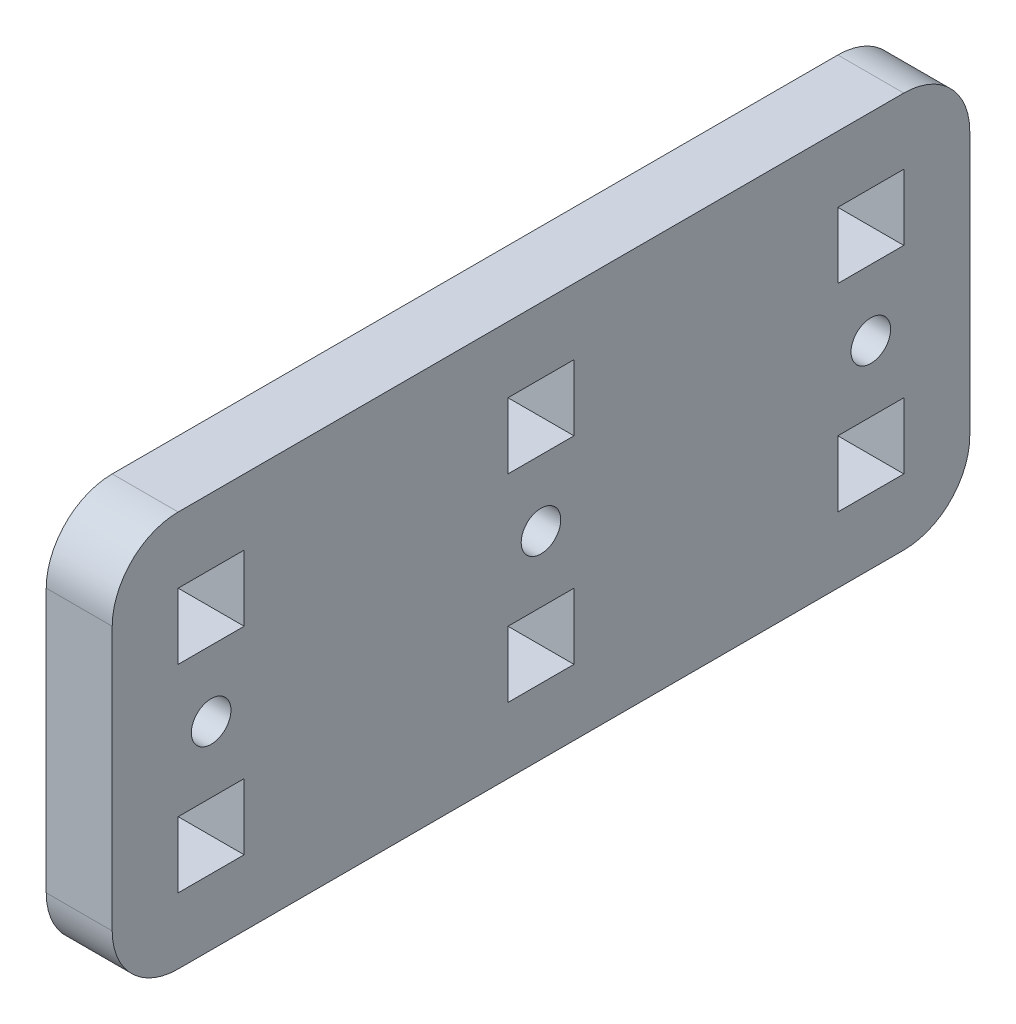
ISO-10303-21;
HEADER;
FILE_DESCRIPTION(('STEP AP214'),'2;1');
FILE_NAME('part.step','',(''),(''),'','','');
FILE_SCHEMA(('AUTOMOTIVE_DESIGN { 1 0 10303 214 1 1 1 1 }'));
ENDSEC;
DATA;
#1=APPLICATION_CONTEXT('core data for automotive mechanical design processes');
#2=APPLICATION_PROTOCOL_DEFINITION('international standard','automotive_design',2000,#1);
#3=PRODUCT_CONTEXT('',#1,'mechanical');
#4=PRODUCT('Part','Part','',(#3));
#5=PRODUCT_RELATED_PRODUCT_CATEGORY('part','',(#4));
#6=PRODUCT_DEFINITION_FORMATION('','',#4);
#7=PRODUCT_DEFINITION_CONTEXT('part definition',#1,'design');
#8=PRODUCT_DEFINITION('design','',#6,#7);
#9=PRODUCT_DEFINITION_SHAPE('','',#8);
#10=(LENGTH_UNIT() NAMED_UNIT(*) SI_UNIT(.MILLI.,.METRE.));
#11=(NAMED_UNIT(*) PLANE_ANGLE_UNIT() SI_UNIT($,.RADIAN.));
#12=(NAMED_UNIT(*) SI_UNIT($,.STERADIAN.) SOLID_ANGLE_UNIT());
#13=UNCERTAINTY_MEASURE_WITH_UNIT(LENGTH_MEASURE(1.E-05),#10,'distance_accuracy_value','');
#14=(GEOMETRIC_REPRESENTATION_CONTEXT(3) GLOBAL_UNCERTAINTY_ASSIGNED_CONTEXT((#13)) GLOBAL_UNIT_ASSIGNED_CONTEXT((#10,
#11,#12)) REPRESENTATION_CONTEXT('',''));
#15=CARTESIAN_POINT('',(0.,0.,0.));
#16=DIRECTION('',(0.,0.,1.));
#17=DIRECTION('',(1.,0.,0.));
#18=AXIS2_PLACEMENT_3D('',#15,#16,#17);
#19=CARTESIAN_POINT('',(5.,0.,0.));
#20=DIRECTION('',(-1.,0.,0.));
#21=DIRECTION('',(0.,0.,1.));
#22=AXIS2_PLACEMENT_3D('',#19,#20,#21);
#23=PLANE('',#22);
#24=DIRECTION('',(0.,0.,-1.));
#25=VECTOR('',#24,1.);
#26=CARTESIAN_POINT('',(4.99999999999997,20.,-30.));
#27=LINE('',#26,#25);
#28=CARTESIAN_POINT('',(4.99999999999997,20.,-30.));
#29=VERTEX_POINT('',#28);
#30=CARTESIAN_POINT('',(5.,20.,-35.));
#31=VERTEX_POINT('',#30);
#32=EDGE_CURVE('E288',#29,#31,#27,.T.);
#33=ORIENTED_EDGE('',*,*,#32,.F.);
#34=DIRECTION('',(0.,-1.,0.));
#35=VECTOR('',#34,1.);
#36=CARTESIAN_POINT('',(4.99999999999997,20.,-30.));
#37=LINE('',#36,#35);
#38=CARTESIAN_POINT('',(5.,25.,-30.));
#39=VERTEX_POINT('',#38);
#40=EDGE_CURVE('E296',#39,#29,#37,.T.);
#41=ORIENTED_EDGE('',*,*,#40,.F.);
#42=DIRECTION('',(0.,0.,1.));
#43=VECTOR('',#42,1.);
#44=CARTESIAN_POINT('',(4.99999999999997,25.,-30.));
#45=LINE('',#44,#43);
#46=CARTESIAN_POINT('',(5.,25.,-35.));
#47=VERTEX_POINT('',#46);
#48=EDGE_CURVE('E293',#47,#39,#45,.T.);
#49=ORIENTED_EDGE('',*,*,#48,.F.);
#50=DIRECTION('',(0.,1.,0.));
#51=VECTOR('',#50,1.);
#52=CARTESIAN_POINT('',(5.,20.,-35.));
#53=LINE('',#52,#51);
#54=EDGE_CURVE('E290',#31,#47,#53,.T.);
#55=ORIENTED_EDGE('',*,*,#54,.F.);
#56=EDGE_LOOP('',(#33,#41,#49,#55));
#57=FACE_BOUND('',#56,.T.);
#58=DIRECTION('',(0.,0.,-1.));
#59=VECTOR('',#58,1.);
#60=CARTESIAN_POINT('',(5.00000000000002,20.,-55.));
#61=LINE('',#60,#59);
#62=CARTESIAN_POINT('',(5.00000000000002,20.,-55.));
#63=VERTEX_POINT('',#62);
#64=CARTESIAN_POINT('',(5.00000000000005,20.,-60.));
#65=VERTEX_POINT('',#64);
#66=EDGE_CURVE('E356',#63,#65,#61,.T.);
#67=ORIENTED_EDGE('',*,*,#66,.F.);
#68=DIRECTION('',(0.,-1.,0.));
#69=VECTOR('',#68,1.);
#70=CARTESIAN_POINT('',(5.00000000000002,20.,-55.));
#71=LINE('',#70,#69);
#72=CARTESIAN_POINT('',(5.,25.,-55.));
#73=VERTEX_POINT('',#72);
#74=EDGE_CURVE('E364',#73,#63,#71,.T.);
#75=ORIENTED_EDGE('',*,*,#74,.F.);
#76=DIRECTION('',(0.,0.,1.));
#77=VECTOR('',#76,1.);
#78=CARTESIAN_POINT('',(5.00000000000002,25.,-55.));
#79=LINE('',#78,#77);
#80=CARTESIAN_POINT('',(5.00000000000005,25.,-60.));
#81=VERTEX_POINT('',#80);
#82=EDGE_CURVE('E361',#81,#73,#79,.T.);
#83=ORIENTED_EDGE('',*,*,#82,.F.);
#84=DIRECTION('',(0.,1.,0.));
#85=VECTOR('',#84,1.);
#86=CARTESIAN_POINT('',(5.00000000000005,20.,-60.));
#87=LINE('',#86,#85);
#88=EDGE_CURVE('E358',#65,#81,#87,.T.);
#89=ORIENTED_EDGE('',*,*,#88,.F.);
#90=EDGE_LOOP('',(#67,#75,#83,#89));
#91=FACE_BOUND('',#90,.T.);
#92=DIRECTION('',(0.,0.,-1.));
#93=VECTOR('',#92,1.);
#94=CARTESIAN_POINT('',(5.,20.,-10.));
#95=LINE('',#94,#93);
#96=CARTESIAN_POINT('',(5.,20.,-5.));
#97=VERTEX_POINT('',#96);
#98=CARTESIAN_POINT('',(5.,20.,-10.));
#99=VERTEX_POINT('',#98);
#100=EDGE_CURVE('E424',#97,#99,#95,.T.);
#101=ORIENTED_EDGE('',*,*,#100,.F.);
#102=DIRECTION('',(0.,-1.,0.));
#103=VECTOR('',#102,1.);
#104=CARTESIAN_POINT('',(5.,20.,-5.));
#105=LINE('',#104,#103);
#106=CARTESIAN_POINT('',(5.,25.,-5.));
#107=VERTEX_POINT('',#106);
#108=EDGE_CURVE('E432',#107,#97,#105,.T.);
#109=ORIENTED_EDGE('',*,*,#108,.F.);
#110=DIRECTION('',(0.,0.,1.));
#111=VECTOR('',#110,1.);
#112=CARTESIAN_POINT('',(5.,25.,-10.));
#113=LINE('',#112,#111);
#114=CARTESIAN_POINT('',(5.,25.,-10.));
#115=VERTEX_POINT('',#114);
#116=EDGE_CURVE('E429',#115,#107,#113,.T.);
#117=ORIENTED_EDGE('',*,*,#116,.F.);
#118=DIRECTION('',(0.,1.,0.));
#119=VECTOR('',#118,1.);
#120=CARTESIAN_POINT('',(5.,20.,-10.));
#121=LINE('',#120,#119);
#122=EDGE_CURVE('E426',#99,#115,#121,.T.);
#123=ORIENTED_EDGE('',*,*,#122,.F.);
#124=EDGE_LOOP('',(#101,#109,#117,#123));
#125=FACE_BOUND('',#124,.T.);
#126=DIRECTION('',(0.,0.,-1.));
#127=VECTOR('',#126,1.);
#128=CARTESIAN_POINT('',(5.,0.,0.));
#129=LINE('',#128,#127);
#130=CARTESIAN_POINT('',(5.,0.,-5.));
#131=VERTEX_POINT('',#130);
#132=CARTESIAN_POINT('',(5.,0.,-60.));
#133=VERTEX_POINT('',#132);
#134=EDGE_CURVE('E458',#131,#133,#129,.T.);
#135=ORIENTED_EDGE('',*,*,#134,.T.);
#136=CARTESIAN_POINT('',(5.,5.00000000000001,-60.));
#137=DIRECTION('',(-1.,0.,0.));
#138=DIRECTION('',(0.,0.,1.));
#139=AXIS2_PLACEMENT_3D('',#136,#137,#138);
#140=CIRCLE('',#139,5.);
#141=CARTESIAN_POINT('',(5.,5.00000000000001,-65.));
#142=VERTEX_POINT('',#141);
#143=EDGE_CURVE('E498',#133,#142,#140,.F.);
#144=ORIENTED_EDGE('',*,*,#143,.T.);
#145=DIRECTION('',(0.,1.,0.));
#146=VECTOR('',#145,1.);
#147=CARTESIAN_POINT('',(5.,0.,-65.));
#148=LINE('',#147,#146);
#149=CARTESIAN_POINT('',(5.,25.,-65.));
#150=VERTEX_POINT('',#149);
#151=EDGE_CURVE('E462',#142,#150,#148,.T.);
#152=ORIENTED_EDGE('',*,*,#151,.T.);
#153=CARTESIAN_POINT('',(5.,25.,-60.));
#154=DIRECTION('',(-1.,0.,0.));
#155=DIRECTION('',(0.,0.,1.));
#156=AXIS2_PLACEMENT_3D('',#153,#154,#155);
#157=CIRCLE('',#156,5.);
#158=CARTESIAN_POINT('',(5.,30.,-60.));
#159=VERTEX_POINT('',#158);
#160=EDGE_CURVE('E55',#150,#159,#157,.F.);
#161=ORIENTED_EDGE('',*,*,#160,.T.);
#162=DIRECTION('',(0.,0.,1.));
#163=VECTOR('',#162,1.);
#164=CARTESIAN_POINT('',(5.,30.,0.));
#165=LINE('',#164,#163);
#166=CARTESIAN_POINT('',(5.,30.,-5.));
#167=VERTEX_POINT('',#166);
#168=EDGE_CURVE('E464',#159,#167,#165,.T.);
#169=ORIENTED_EDGE('',*,*,#168,.T.);
#170=CARTESIAN_POINT('',(5.,25.,-5.));
#171=DIRECTION('',(-1.,0.,0.));
#172=DIRECTION('',(0.,0.,1.));
#173=AXIS2_PLACEMENT_3D('',#170,#171,#172);
#174=CIRCLE('',#173,5.);
#175=CARTESIAN_POINT('',(5.,25.,0.));
#176=VERTEX_POINT('',#175);
#177=EDGE_CURVE('E493',#167,#176,#174,.F.);
#178=ORIENTED_EDGE('',*,*,#177,.T.);
#179=DIRECTION('',(0.,-1.,0.));
#180=VECTOR('',#179,1.);
#181=CARTESIAN_POINT('',(5.,0.,0.));
#182=LINE('',#181,#180);
#183=CARTESIAN_POINT('',(5.,5.,0.));
#184=VERTEX_POINT('',#183);
#185=EDGE_CURVE('E455',#176,#184,#182,.T.);
#186=ORIENTED_EDGE('',*,*,#185,.T.);
#187=CARTESIAN_POINT('',(5.,5.,-5.));
#188=DIRECTION('',(-1.,0.,0.));
#189=DIRECTION('',(0.,0.,1.));
#190=AXIS2_PLACEMENT_3D('',#187,#188,#189);
#191=CIRCLE('',#190,5.);
#192=EDGE_CURVE('E495',#184,#131,#191,.F.);
#193=ORIENTED_EDGE('',*,*,#192,.T.);
#194=EDGE_LOOP('',(#135,#144,#152,#161,#169,#178,#186,#193));
#195=FACE_BOUND('',#194,.T.);
#196=DIRECTION('',(0.,0.,1.));
#197=VECTOR('',#196,1.);
#198=CARTESIAN_POINT('',(5.,10.,-10.));
#199=LINE('',#198,#197);
#200=CARTESIAN_POINT('',(5.,10.,-10.));
#201=VERTEX_POINT('',#200);
#202=CARTESIAN_POINT('',(5.,10.,-5.));
#203=VERTEX_POINT('',#202);
#204=EDGE_CURVE('E393',#201,#203,#199,.T.);
#205=ORIENTED_EDGE('',*,*,#204,.F.);
#206=DIRECTION('',(0.,1.,0.));
#207=VECTOR('',#206,1.);
#208=CARTESIAN_POINT('',(5.,10.,-10.));
#209=LINE('',#208,#207);
#210=CARTESIAN_POINT('',(5.,5.,-10.));
#211=VERTEX_POINT('',#210);
#212=EDGE_CURVE('E401',#211,#201,#209,.T.);
#213=ORIENTED_EDGE('',*,*,#212,.F.);
#214=DIRECTION('',(0.,0.,-1.));
#215=VECTOR('',#214,1.);
#216=CARTESIAN_POINT('',(5.,5.,-10.));
#217=LINE('',#216,#215);
#218=CARTESIAN_POINT('',(5.,5.,-5.));
#219=VERTEX_POINT('',#218);
#220=EDGE_CURVE('E398',#219,#211,#217,.T.);
#221=ORIENTED_EDGE('',*,*,#220,.F.);
#222=DIRECTION('',(0.,-1.,0.));
#223=VECTOR('',#222,1.);
#224=CARTESIAN_POINT('',(5.,10.,-5.));
#225=LINE('',#224,#223);
#226=EDGE_CURVE('E395',#203,#219,#225,.T.);
#227=ORIENTED_EDGE('',*,*,#226,.F.);
#228=EDGE_LOOP('',(#205,#213,#221,#227));
#229=FACE_BOUND('',#228,.T.);
#230=CARTESIAN_POINT('',(5.,15.,-7.5));
#231=DIRECTION('',(1.,0.,0.));
#232=DIRECTION('',(0.,0.,-1.));
#233=AXIS2_PLACEMENT_3D('',#230,#231,#232);
#234=CIRCLE('',#233,1.5);
#235=CARTESIAN_POINT('',(5.,15.,-9.));
#236=VERTEX_POINT('',#235);
#237=EDGE_CURVE('E387',#236,#236,#234,.T.);
#238=ORIENTED_EDGE('',*,*,#237,.F.);
#239=EDGE_LOOP('',(#238));
#240=FACE_BOUND('',#239,.T.);
#241=DIRECTION('',(0.,0.,1.));
#242=VECTOR('',#241,1.);
#243=CARTESIAN_POINT('',(5.00000000000002,10.,-55.));
#244=LINE('',#243,#242);
#245=CARTESIAN_POINT('',(5.00000000000005,10.,-60.));
#246=VERTEX_POINT('',#245);
#247=CARTESIAN_POINT('',(5.00000000000002,10.,-55.));
#248=VERTEX_POINT('',#247);
#249=EDGE_CURVE('E325',#246,#248,#244,.T.);
#250=ORIENTED_EDGE('',*,*,#249,.F.);
#251=DIRECTION('',(0.,1.,0.));
#252=VECTOR('',#251,1.);
#253=CARTESIAN_POINT('',(5.00000000000005,10.,-60.));
#254=LINE('',#253,#252);
#255=CARTESIAN_POINT('',(5.,5.,-60.));
#256=VERTEX_POINT('',#255);
#257=EDGE_CURVE('E333',#256,#246,#254,.T.);
#258=ORIENTED_EDGE('',*,*,#257,.F.);
#259=DIRECTION('',(0.,0.,-1.));
#260=VECTOR('',#259,1.);
#261=CARTESIAN_POINT('',(5.00000000000002,5.,-55.));
#262=LINE('',#261,#260);
#263=CARTESIAN_POINT('',(5.00000000000002,5.,-55.));
#264=VERTEX_POINT('',#263);
#265=EDGE_CURVE('E330',#264,#256,#262,.T.);
#266=ORIENTED_EDGE('',*,*,#265,.F.);
#267=DIRECTION('',(0.,-1.,0.));
#268=VECTOR('',#267,1.);
#269=CARTESIAN_POINT('',(5.00000000000002,10.,-55.));
#270=LINE('',#269,#268);
#271=EDGE_CURVE('E327',#248,#264,#270,.T.);
#272=ORIENTED_EDGE('',*,*,#271,.F.);
#273=EDGE_LOOP('',(#250,#258,#266,#272));
#274=FACE_BOUND('',#273,.T.);
#275=CARTESIAN_POINT('',(5.00000000000003,15.,-57.5));
#276=DIRECTION('',(1.,0.,0.));
#277=DIRECTION('',(0.,0.,1.));
#278=AXIS2_PLACEMENT_3D('',#275,#276,#277);
#279=CIRCLE('',#278,1.5);
#280=CARTESIAN_POINT('',(5.00000000000002,15.,-56.));
#281=VERTEX_POINT('',#280);
#282=EDGE_CURVE('E319',#281,#281,#279,.T.);
#283=ORIENTED_EDGE('',*,*,#282,.F.);
#284=EDGE_LOOP('',(#283));
#285=FACE_BOUND('',#284,.T.);
#286=DIRECTION('',(0.,0.,1.));
#287=VECTOR('',#286,1.);
#288=CARTESIAN_POINT('',(4.99999999999997,10.,-30.));
#289=LINE('',#288,#287);
#290=CARTESIAN_POINT('',(5.,10.,-35.));
#291=VERTEX_POINT('',#290);
#292=CARTESIAN_POINT('',(4.99999999999997,10.,-30.));
#293=VERTEX_POINT('',#292);
#294=EDGE_CURVE('E244',#291,#293,#289,.T.);
#295=ORIENTED_EDGE('',*,*,#294,.F.);
#296=DIRECTION('',(0.,1.,0.));
#297=VECTOR('',#296,1.);
#298=CARTESIAN_POINT('',(5.,10.,-35.));
#299=LINE('',#298,#297);
#300=CARTESIAN_POINT('',(5.,5.,-35.));
#301=VERTEX_POINT('',#300);
#302=EDGE_CURVE('E270',#301,#291,#299,.T.);
#303=ORIENTED_EDGE('',*,*,#302,.F.);
#304=DIRECTION('',(0.,0.,-1.));
#305=VECTOR('',#304,1.);
#306=CARTESIAN_POINT('',(4.99999999999997,5.,-30.));
#307=LINE('',#306,#305);
#308=CARTESIAN_POINT('',(4.99999999999997,5.,-30.));
#309=VERTEX_POINT('',#308);
#310=EDGE_CURVE('E268',#309,#301,#307,.T.);
#311=ORIENTED_EDGE('',*,*,#310,.F.);
#312=DIRECTION('',(0.,-1.,0.));
#313=VECTOR('',#312,1.);
#314=CARTESIAN_POINT('',(4.99999999999997,10.,-30.));
#315=LINE('',#314,#313);
#316=EDGE_CURVE('E254',#293,#309,#315,.T.);
#317=ORIENTED_EDGE('',*,*,#316,.F.);
#318=EDGE_LOOP('',(#295,#303,#311,#317));
#319=FACE_BOUND('',#318,.T.);
#320=CARTESIAN_POINT('',(4.99999999999998,15.,-32.5));
#321=DIRECTION('',(1.,0.,0.));
#322=DIRECTION('',(0.,0.,1.));
#323=AXIS2_PLACEMENT_3D('',#320,#321,#322);
#324=CIRCLE('',#323,1.5);
#325=CARTESIAN_POINT('',(4.99999999999997,15.,-31.));
#326=VERTEX_POINT('',#325);
#327=EDGE_CURVE('E277',#326,#326,#324,.T.);
#328=ORIENTED_EDGE('',*,*,#327,.F.);
#329=EDGE_LOOP('',(#328));
#330=FACE_BOUND('',#329,.T.);
#331=ADVANCED_FACE('F33',(#57,#91,#125,#195,#229,#240,#274,#285,#319,#330),#23,.F.);
#332=CARTESIAN_POINT('',(0.,0.,0.));
#333=DIRECTION('',(-1.,0.,0.));
#334=DIRECTION('',(0.,0.,1.));
#335=AXIS2_PLACEMENT_3D('',#332,#333,#334);
#336=PLANE('',#335);
#337=DIRECTION('',(0.,1.,0.));
#338=VECTOR('',#337,1.);
#339=CARTESIAN_POINT('',(0.,10.,-35.));
#340=LINE('',#339,#338);
#341=CARTESIAN_POINT('',(0.,5.,-35.));
#342=VERTEX_POINT('',#341);
#343=CARTESIAN_POINT('',(0.,10.,-35.));
#344=VERTEX_POINT('',#343);
#345=EDGE_CURVE('E255',#342,#344,#340,.T.);
#346=ORIENTED_EDGE('',*,*,#345,.T.);
#347=DIRECTION('',(0.,0.,1.));
#348=VECTOR('',#347,1.);
#349=CARTESIAN_POINT('',(0.,10.,-30.));
#350=LINE('',#349,#348);
#351=CARTESIAN_POINT('',(0.,10.,-30.));
#352=VERTEX_POINT('',#351);
#353=EDGE_CURVE('E275',#344,#352,#350,.T.);
#354=ORIENTED_EDGE('',*,*,#353,.T.);
#355=DIRECTION('',(0.,-1.,0.));
#356=VECTOR('',#355,1.);
#357=CARTESIAN_POINT('',(0.,10.,-30.));
#358=LINE('',#357,#356);
#359=CARTESIAN_POINT('',(0.,5.,-30.));
#360=VERTEX_POINT('',#359);
#361=EDGE_CURVE('E261',#352,#360,#358,.T.);
#362=ORIENTED_EDGE('',*,*,#361,.T.);
#363=DIRECTION('',(0.,0.,-1.));
#364=VECTOR('',#363,1.);
#365=CARTESIAN_POINT('',(0.,5.,-30.));
#366=LINE('',#365,#364);
#367=EDGE_CURVE('E279',#360,#342,#366,.T.);
#368=ORIENTED_EDGE('',*,*,#367,.T.);
#369=EDGE_LOOP('',(#346,#354,#362,#368));
#370=FACE_BOUND('',#369,.T.);
#371=DIRECTION('',(0.,-1.,0.));
#372=VECTOR('',#371,1.);
#373=CARTESIAN_POINT('',(0.,20.,-30.));
#374=LINE('',#373,#372);
#375=CARTESIAN_POINT('',(0.,25.,-30.));
#376=VERTEX_POINT('',#375);
#377=CARTESIAN_POINT('',(0.,20.,-30.));
#378=VERTEX_POINT('',#377);
#379=EDGE_CURVE('E291',#376,#378,#374,.T.);
#380=ORIENTED_EDGE('',*,*,#379,.T.);
#381=DIRECTION('',(0.,0.,-1.));
#382=VECTOR('',#381,1.);
#383=CARTESIAN_POINT('',(0.,20.,-30.));
#384=LINE('',#383,#382);
#385=CARTESIAN_POINT('',(0.,20.,-35.));
#386=VERTEX_POINT('',#385);
#387=EDGE_CURVE('E262',#378,#386,#384,.T.);
#388=ORIENTED_EDGE('',*,*,#387,.T.);
#389=DIRECTION('',(0.,1.,0.));
#390=VECTOR('',#389,1.);
#391=CARTESIAN_POINT('',(0.,20.,-35.));
#392=LINE('',#391,#390);
#393=CARTESIAN_POINT('',(0.,25.,-35.));
#394=VERTEX_POINT('',#393);
#395=EDGE_CURVE('E301',#386,#394,#392,.T.);
#396=ORIENTED_EDGE('',*,*,#395,.T.);
#397=DIRECTION('',(0.,0.,1.));
#398=VECTOR('',#397,1.);
#399=CARTESIAN_POINT('',(0.,25.,-30.));
#400=LINE('',#399,#398);
#401=EDGE_CURVE('E304',#394,#376,#400,.T.);
#402=ORIENTED_EDGE('',*,*,#401,.T.);
#403=EDGE_LOOP('',(#380,#388,#396,#402));
#404=FACE_BOUND('',#403,.T.);
#405=CARTESIAN_POINT('',(0.,15.,-57.5));
#406=DIRECTION('',(1.,0.,0.));
#407=DIRECTION('',(0.,0.,1.));
#408=AXIS2_PLACEMENT_3D('',#405,#406,#407);
#409=CIRCLE('',#408,1.5);
#410=CARTESIAN_POINT('',(0.,15.,-56.));
#411=VERTEX_POINT('',#410);
#412=EDGE_CURVE('E318',#411,#411,#409,.T.);
#413=ORIENTED_EDGE('',*,*,#412,.T.);
#414=EDGE_LOOP('',(#413));
#415=FACE_BOUND('',#414,.T.);
#416=DIRECTION('',(0.,1.,0.));
#417=VECTOR('',#416,1.);
#418=CARTESIAN_POINT('',(0.,10.,-10.));
#419=LINE('',#418,#417);
#420=CARTESIAN_POINT('',(0.,5.,-10.));
#421=VERTEX_POINT('',#420);
#422=CARTESIAN_POINT('',(0.,10.,-10.));
#423=VERTEX_POINT('',#422);
#424=EDGE_CURVE('E396',#421,#423,#419,.T.);
#425=ORIENTED_EDGE('',*,*,#424,.T.);
#426=DIRECTION('',(0.,0.,1.));
#427=VECTOR('',#426,1.);
#428=CARTESIAN_POINT('',(0.,10.,-10.));
#429=LINE('',#428,#427);
#430=CARTESIAN_POINT('',(0.,10.,-5.));
#431=VERTEX_POINT('',#430);
#432=EDGE_CURVE('E390',#423,#431,#429,.T.);
#433=ORIENTED_EDGE('',*,*,#432,.T.);
#434=DIRECTION('',(0.,-1.,0.));
#435=VECTOR('',#434,1.);
#436=CARTESIAN_POINT('',(0.,10.,-5.));
#437=LINE('',#436,#435);
#438=CARTESIAN_POINT('',(0.,5.,-5.));
#439=VERTEX_POINT('',#438);
#440=EDGE_CURVE('E406',#431,#439,#437,.T.);
#441=ORIENTED_EDGE('',*,*,#440,.T.);
#442=DIRECTION('',(0.,0.,-1.));
#443=VECTOR('',#442,1.);
#444=CARTESIAN_POINT('',(0.,5.,-10.));
#445=LINE('',#444,#443);
#446=EDGE_CURVE('E409',#439,#421,#445,.T.);
#447=ORIENTED_EDGE('',*,*,#446,.T.);
#448=EDGE_LOOP('',(#425,#433,#441,#447));
#449=FACE_BOUND('',#448,.T.);
#450=DIRECTION('',(0.,-1.,0.));
#451=VECTOR('',#450,1.);
#452=CARTESIAN_POINT('',(0.,20.,-5.));
#453=LINE('',#452,#451);
#454=CARTESIAN_POINT('',(0.,25.,-5.));
#455=VERTEX_POINT('',#454);
#456=CARTESIAN_POINT('',(0.,20.,-5.));
#457=VERTEX_POINT('',#456);
#458=EDGE_CURVE('E427',#455,#457,#453,.T.);
#459=ORIENTED_EDGE('',*,*,#458,.T.);
#460=DIRECTION('',(0.,0.,-1.));
#461=VECTOR('',#460,1.);
#462=CARTESIAN_POINT('',(0.,20.,-10.));
#463=LINE('',#462,#461);
#464=CARTESIAN_POINT('',(0.,20.,-10.));
#465=VERTEX_POINT('',#464);
#466=EDGE_CURVE('E423',#457,#465,#463,.T.);
#467=ORIENTED_EDGE('',*,*,#466,.T.);
#468=DIRECTION('',(0.,1.,0.));
#469=VECTOR('',#468,1.);
#470=CARTESIAN_POINT('',(0.,20.,-10.));
#471=LINE('',#470,#469);
#472=CARTESIAN_POINT('',(0.,25.,-10.));
#473=VERTEX_POINT('',#472);
#474=EDGE_CURVE('E437',#465,#473,#471,.T.);
#475=ORIENTED_EDGE('',*,*,#474,.T.);
#476=DIRECTION('',(0.,0.,1.));
#477=VECTOR('',#476,1.);
#478=CARTESIAN_POINT('',(0.,25.,-10.));
#479=LINE('',#478,#477);
#480=EDGE_CURVE('E440',#473,#455,#479,.T.);
#481=ORIENTED_EDGE('',*,*,#480,.T.);
#482=EDGE_LOOP('',(#459,#467,#475,#481));
#483=FACE_BOUND('',#482,.T.);
#484=DIRECTION('',(0.,1.,0.));
#485=VECTOR('',#484,1.);
#486=CARTESIAN_POINT('',(0.,0.,-65.));
#487=LINE('',#486,#485);
#488=CARTESIAN_POINT('',(0.,5.00000000000001,-65.));
#489=VERTEX_POINT('',#488);
#490=CARTESIAN_POINT('',(0.,25.,-65.));
#491=VERTEX_POINT('',#490);
#492=EDGE_CURVE('E472',#489,#491,#487,.T.);
#493=ORIENTED_EDGE('',*,*,#492,.F.);
#494=CARTESIAN_POINT('',(0.,5.00000000000001,-60.));
#495=DIRECTION('',(-1.,0.,0.));
#496=DIRECTION('',(0.,0.,1.));
#497=AXIS2_PLACEMENT_3D('',#494,#495,#496);
#498=CIRCLE('',#497,5.);
#499=CARTESIAN_POINT('',(0.,0.,-60.));
#500=VERTEX_POINT('',#499);
#501=EDGE_CURVE('E486',#489,#500,#498,.T.);
#502=ORIENTED_EDGE('',*,*,#501,.T.);
#503=DIRECTION('',(0.,0.,-1.));
#504=VECTOR('',#503,1.);
#505=CARTESIAN_POINT('',(0.,0.,0.));
#506=LINE('',#505,#504);
#507=CARTESIAN_POINT('',(0.,0.,-5.));
#508=VERTEX_POINT('',#507);
#509=EDGE_CURVE('E469',#508,#500,#506,.T.);
#510=ORIENTED_EDGE('',*,*,#509,.F.);
#511=CARTESIAN_POINT('',(0.,5.,-5.));
#512=DIRECTION('',(-1.,0.,0.));
#513=DIRECTION('',(0.,0.,1.));
#514=AXIS2_PLACEMENT_3D('',#511,#512,#513);
#515=CIRCLE('',#514,5.);
#516=CARTESIAN_POINT('',(0.,5.,0.));
#517=VERTEX_POINT('',#516);
#518=EDGE_CURVE('E482',#508,#517,#515,.T.);
#519=ORIENTED_EDGE('',*,*,#518,.T.);
#520=DIRECTION('',(0.,-1.,0.));
#521=VECTOR('',#520,1.);
#522=CARTESIAN_POINT('',(0.,0.,0.));
#523=LINE('',#522,#521);
#524=CARTESIAN_POINT('',(0.,25.,0.));
#525=VERTEX_POINT('',#524);
#526=EDGE_CURVE('E454',#525,#517,#523,.T.);
#527=ORIENTED_EDGE('',*,*,#526,.F.);
#528=CARTESIAN_POINT('',(0.,25.,-5.));
#529=DIRECTION('',(-1.,0.,0.));
#530=DIRECTION('',(0.,0.,1.));
#531=AXIS2_PLACEMENT_3D('',#528,#529,#530);
#532=CIRCLE('',#531,5.);
#533=CARTESIAN_POINT('',(0.,30.,-5.));
#534=VERTEX_POINT('',#533);
#535=EDGE_CURVE('E480',#525,#534,#532,.T.);
#536=ORIENTED_EDGE('',*,*,#535,.T.);
#537=DIRECTION('',(0.,0.,1.));
#538=VECTOR('',#537,1.);
#539=CARTESIAN_POINT('',(0.,30.,0.));
#540=LINE('',#539,#538);
#541=CARTESIAN_POINT('',(0.,30.,-60.));
#542=VERTEX_POINT('',#541);
#543=EDGE_CURVE('E459',#542,#534,#540,.T.);
#544=ORIENTED_EDGE('',*,*,#543,.F.);
#545=CARTESIAN_POINT('',(0.,25.,-60.));
#546=DIRECTION('',(-1.,0.,0.));
#547=DIRECTION('',(0.,0.,1.));
#548=AXIS2_PLACEMENT_3D('',#545,#546,#547);
#549=CIRCLE('',#548,5.);
#550=EDGE_CURVE('E484',#542,#491,#549,.T.);
#551=ORIENTED_EDGE('',*,*,#550,.T.);
#552=EDGE_LOOP('',(#493,#502,#510,#519,#527,#536,#544,#551));
#553=FACE_BOUND('',#552,.T.);
#554=CARTESIAN_POINT('',(0.,15.,-7.5));
#555=DIRECTION('',(1.,0.,0.));
#556=DIRECTION('',(0.,0.,-1.));
#557=AXIS2_PLACEMENT_3D('',#554,#555,#556);
#558=CIRCLE('',#557,1.5);
#559=CARTESIAN_POINT('',(0.,15.,-9.));
#560=VERTEX_POINT('',#559);
#561=EDGE_CURVE('E386',#560,#560,#558,.T.);
#562=ORIENTED_EDGE('',*,*,#561,.T.);
#563=EDGE_LOOP('',(#562));
#564=FACE_BOUND('',#563,.T.);
#565=DIRECTION('',(0.,-1.,0.));
#566=VECTOR('',#565,1.);
#567=CARTESIAN_POINT('',(0.,20.,-55.));
#568=LINE('',#567,#566);
#569=CARTESIAN_POINT('',(0.,25.,-55.));
#570=VERTEX_POINT('',#569);
#571=CARTESIAN_POINT('',(0.,20.,-55.));
#572=VERTEX_POINT('',#571);
#573=EDGE_CURVE('E359',#570,#572,#568,.T.);
#574=ORIENTED_EDGE('',*,*,#573,.T.);
#575=DIRECTION('',(0.,0.,-1.));
#576=VECTOR('',#575,1.);
#577=CARTESIAN_POINT('',(0.,20.,-55.));
#578=LINE('',#577,#576);
#579=CARTESIAN_POINT('',(0.,20.,-60.));
#580=VERTEX_POINT('',#579);
#581=EDGE_CURVE('E355',#572,#580,#578,.T.);
#582=ORIENTED_EDGE('',*,*,#581,.T.);
#583=DIRECTION('',(0.,1.,0.));
#584=VECTOR('',#583,1.);
#585=CARTESIAN_POINT('',(0.,20.,-60.));
#586=LINE('',#585,#584);
#587=CARTESIAN_POINT('',(0.,25.,-60.));
#588=VERTEX_POINT('',#587);
#589=EDGE_CURVE('E369',#580,#588,#586,.T.);
#590=ORIENTED_EDGE('',*,*,#589,.T.);
#591=DIRECTION('',(0.,0.,1.));
#592=VECTOR('',#591,1.);
#593=CARTESIAN_POINT('',(0.,25.,-55.));
#594=LINE('',#593,#592);
#595=EDGE_CURVE('E372',#588,#570,#594,.T.);
#596=ORIENTED_EDGE('',*,*,#595,.T.);
#597=EDGE_LOOP('',(#574,#582,#590,#596));
#598=FACE_BOUND('',#597,.T.);
#599=DIRECTION('',(0.,1.,0.));
#600=VECTOR('',#599,1.);
#601=CARTESIAN_POINT('',(0.,10.,-60.));
#602=LINE('',#601,#600);
#603=CARTESIAN_POINT('',(0.,5.,-60.));
#604=VERTEX_POINT('',#603);
#605=CARTESIAN_POINT('',(0.,10.,-60.));
#606=VERTEX_POINT('',#605);
#607=EDGE_CURVE('E328',#604,#606,#602,.T.);
#608=ORIENTED_EDGE('',*,*,#607,.T.);
#609=DIRECTION('',(0.,0.,1.));
#610=VECTOR('',#609,1.);
#611=CARTESIAN_POINT('',(0.,10.,-55.));
#612=LINE('',#611,#610);
#613=CARTESIAN_POINT('',(0.,10.,-55.));
#614=VERTEX_POINT('',#613);
#615=EDGE_CURVE('E322',#606,#614,#612,.T.);
#616=ORIENTED_EDGE('',*,*,#615,.T.);
#617=DIRECTION('',(0.,-1.,0.));
#618=VECTOR('',#617,1.);
#619=CARTESIAN_POINT('',(0.,10.,-55.));
#620=LINE('',#619,#618);
#621=CARTESIAN_POINT('',(0.,5.,-55.));
#622=VERTEX_POINT('',#621);
#623=EDGE_CURVE('E338',#614,#622,#620,.T.);
#624=ORIENTED_EDGE('',*,*,#623,.T.);
#625=DIRECTION('',(0.,0.,-1.));
#626=VECTOR('',#625,1.);
#627=CARTESIAN_POINT('',(0.,5.,-55.));
#628=LINE('',#627,#626);
#629=EDGE_CURVE('E341',#622,#604,#628,.T.);
#630=ORIENTED_EDGE('',*,*,#629,.T.);
#631=EDGE_LOOP('',(#608,#616,#624,#630));
#632=FACE_BOUND('',#631,.T.);
#633=CARTESIAN_POINT('',(0.,15.,-32.5));
#634=DIRECTION('',(1.,0.,0.));
#635=DIRECTION('',(0.,0.,1.));
#636=AXIS2_PLACEMENT_3D('',#633,#634,#635);
#637=CIRCLE('',#636,1.5);
#638=CARTESIAN_POINT('',(0.,15.,-31.));
#639=VERTEX_POINT('',#638);
#640=EDGE_CURVE('E929',#639,#639,#637,.T.);
#641=ORIENTED_EDGE('',*,*,#640,.T.);
#642=EDGE_LOOP('',(#641));
#643=FACE_BOUND('',#642,.T.);
#644=ADVANCED_FACE('F514',(#370,#404,#415,#449,#483,#553,#564,#598,#632,#643),#336,.T.);
#645=CARTESIAN_POINT('',(5.,0.,0.));
#646=DIRECTION('',(0.,0.,-1.));
#647=DIRECTION('',(0.,1.,0.));
#648=AXIS2_PLACEMENT_3D('',#645,#646,#647);
#649=PLANE('',#648);
#650=ORIENTED_EDGE('',*,*,#526,.T.);
#651=DIRECTION('',(-1.,0.,0.));
#652=VECTOR('',#651,1.);
#653=CARTESIAN_POINT('',(5.,5.,0.));
#654=LINE('',#653,#652);
#655=EDGE_CURVE('E11',#517,#184,#654,.F.);
#656=ORIENTED_EDGE('',*,*,#655,.T.);
#657=ORIENTED_EDGE('',*,*,#185,.F.);
#658=DIRECTION('',(-1.,0.,0.));
#659=VECTOR('',#658,1.);
#660=CARTESIAN_POINT('',(5.,25.,0.));
#661=LINE('',#660,#659);
#662=EDGE_CURVE('E41',#176,#525,#661,.T.);
#663=ORIENTED_EDGE('',*,*,#662,.T.);
#664=EDGE_LOOP('',(#650,#656,#657,#663));
#665=FACE_BOUND('',#664,.T.);
#666=ADVANCED_FACE('F508',(#665),#649,.F.);
#667=CARTESIAN_POINT('',(5.,0.,0.));
#668=DIRECTION('',(0.,1.,0.));
#669=DIRECTION('',(0.,0.,1.));
#670=AXIS2_PLACEMENT_3D('',#667,#668,#669);
#671=PLANE('',#670);
#672=ORIENTED_EDGE('',*,*,#509,.T.);
#673=DIRECTION('',(-1.,0.,0.));
#674=VECTOR('',#673,1.);
#675=CARTESIAN_POINT('',(5.,0.,-60.));
#676=LINE('',#675,#674);
#677=EDGE_CURVE('E491',#500,#133,#676,.F.);
#678=ORIENTED_EDGE('',*,*,#677,.T.);
#679=ORIENTED_EDGE('',*,*,#134,.F.);
#680=DIRECTION('',(-1.,0.,0.));
#681=VECTOR('',#680,1.);
#682=CARTESIAN_POINT('',(5.,0.,-5.));
#683=LINE('',#682,#681);
#684=EDGE_CURVE('E488',#131,#508,#683,.T.);
#685=ORIENTED_EDGE('',*,*,#684,.T.);
#686=EDGE_LOOP('',(#672,#678,#679,#685));
#687=FACE_BOUND('',#686,.T.);
#688=ADVANCED_FACE('F524',(#687),#671,.F.);
#689=CARTESIAN_POINT('',(5.,0.,-65.));
#690=DIRECTION('',(0.,0.,1.));
#691=DIRECTION('',(1.,0.,0.));
#692=AXIS2_PLACEMENT_3D('',#689,#690,#691);
#693=PLANE('',#692);
#694=ORIENTED_EDGE('',*,*,#151,.F.);
#695=DIRECTION('',(-1.,0.,0.));
#696=VECTOR('',#695,1.);
#697=CARTESIAN_POINT('',(5.,5.00000000000001,-65.));
#698=LINE('',#697,#696);
#699=EDGE_CURVE('E477',#142,#489,#698,.T.);
#700=ORIENTED_EDGE('',*,*,#699,.T.);
#701=ORIENTED_EDGE('',*,*,#492,.T.);
#702=DIRECTION('',(-1.,0.,0.));
#703=VECTOR('',#702,1.);
#704=CARTESIAN_POINT('',(5.,25.,-65.));
#705=LINE('',#704,#703);
#706=EDGE_CURVE('E466',#491,#150,#705,.F.);
#707=ORIENTED_EDGE('',*,*,#706,.T.);
#708=EDGE_LOOP('',(#694,#700,#701,#707));
#709=FACE_BOUND('',#708,.T.);
#710=ADVANCED_FACE('F533',(#709),#693,.F.);
#711=CARTESIAN_POINT('',(5.,30.,0.));
#712=DIRECTION('',(0.,-1.,0.));
#713=DIRECTION('',(0.,0.,-1.));
#714=AXIS2_PLACEMENT_3D('',#711,#712,#713);
#715=PLANE('',#714);
#716=ORIENTED_EDGE('',*,*,#168,.F.);
#717=DIRECTION('',(-1.,0.,0.));
#718=VECTOR('',#717,1.);
#719=CARTESIAN_POINT('',(5.,30.,-60.));
#720=LINE('',#719,#718);
#721=EDGE_CURVE('E501',#159,#542,#720,.T.);
#722=ORIENTED_EDGE('',*,*,#721,.T.);
#723=ORIENTED_EDGE('',*,*,#543,.T.);
#724=DIRECTION('',(-1.,0.,0.));
#725=VECTOR('',#724,1.);
#726=CARTESIAN_POINT('',(5.,30.,-5.));
#727=LINE('',#726,#725);
#728=EDGE_CURVE('E48',#534,#167,#727,.F.);
#729=ORIENTED_EDGE('',*,*,#728,.T.);
#730=EDGE_LOOP('',(#716,#722,#723,#729));
#731=FACE_BOUND('',#730,.T.);
#732=ADVANCED_FACE('F538',(#731),#715,.F.);
#733=CARTESIAN_POINT('',(5.,20.,-10.));
#734=DIRECTION('',(0.,1.,0.));
#735=DIRECTION('',(0.,0.,1.));
#736=AXIS2_PLACEMENT_3D('',#733,#734,#735);
#737=PLANE('',#736);
#738=ORIENTED_EDGE('',*,*,#466,.F.);
#739=DIRECTION('',(-1.,0.,0.));
#740=VECTOR('',#739,1.);
#741=CARTESIAN_POINT('',(5.,20.,-5.));
#742=LINE('',#741,#740);
#743=EDGE_CURVE('E434',#97,#457,#742,.T.);
#744=ORIENTED_EDGE('',*,*,#743,.F.);
#745=ORIENTED_EDGE('',*,*,#100,.T.);
#746=DIRECTION('',(-1.,0.,0.));
#747=VECTOR('',#746,1.);
#748=CARTESIAN_POINT('',(5.,20.,-10.));
#749=LINE('',#748,#747);
#750=EDGE_CURVE('E451',#99,#465,#749,.T.);
#751=ORIENTED_EDGE('',*,*,#750,.T.);
#752=EDGE_LOOP('',(#738,#744,#745,#751));
#753=FACE_BOUND('',#752,.T.);
#754=ADVANCED_FACE('F554',(#753),#737,.T.);
#755=CARTESIAN_POINT('',(5.,20.,-10.));
#756=DIRECTION('',(0.,0.,1.));
#757=DIRECTION('',(0.,-1.,0.));
#758=AXIS2_PLACEMENT_3D('',#755,#756,#757);
#759=PLANE('',#758);
#760=ORIENTED_EDGE('',*,*,#474,.F.);
#761=ORIENTED_EDGE('',*,*,#750,.F.);
#762=ORIENTED_EDGE('',*,*,#122,.T.);
#763=DIRECTION('',(-1.,0.,0.));
#764=VECTOR('',#763,1.);
#765=CARTESIAN_POINT('',(5.,25.,-10.));
#766=LINE('',#765,#764);
#767=EDGE_CURVE('E449',#115,#473,#766,.T.);
#768=ORIENTED_EDGE('',*,*,#767,.T.);
#769=EDGE_LOOP('',(#760,#761,#762,#768));
#770=FACE_BOUND('',#769,.T.);
#771=ADVANCED_FACE('F810',(#770),#759,.T.);
#772=CARTESIAN_POINT('',(5.,25.,-10.));
#773=DIRECTION('',(0.,-1.,0.));
#774=DIRECTION('',(0.,0.,-1.));
#775=AXIS2_PLACEMENT_3D('',#772,#773,#774);
#776=PLANE('',#775);
#777=ORIENTED_EDGE('',*,*,#480,.F.);
#778=ORIENTED_EDGE('',*,*,#767,.F.);
#779=ORIENTED_EDGE('',*,*,#116,.T.);
#780=DIRECTION('',(-1.,0.,0.));
#781=VECTOR('',#780,1.);
#782=CARTESIAN_POINT('',(5.,25.,-5.));
#783=LINE('',#782,#781);
#784=EDGE_CURVE('E447',#107,#455,#783,.T.);
#785=ORIENTED_EDGE('',*,*,#784,.T.);
#786=EDGE_LOOP('',(#777,#778,#779,#785));
#787=FACE_BOUND('',#786,.T.);
#788=ADVANCED_FACE('F801',(#787),#776,.T.);
#789=CARTESIAN_POINT('',(5.,20.,-5.));
#790=DIRECTION('',(0.,0.,-1.));
#791=DIRECTION('',(0.,1.,0.));
#792=AXIS2_PLACEMENT_3D('',#789,#790,#791);
#793=PLANE('',#792);
#794=ORIENTED_EDGE('',*,*,#458,.F.);
#795=ORIENTED_EDGE('',*,*,#784,.F.);
#796=ORIENTED_EDGE('',*,*,#108,.T.);
#797=ORIENTED_EDGE('',*,*,#743,.T.);
#798=EDGE_LOOP('',(#794,#795,#796,#797));
#799=FACE_BOUND('',#798,.T.);
#800=ADVANCED_FACE('F792',(#799),#793,.T.);
#801=CARTESIAN_POINT('',(5.,10.,-10.));
#802=DIRECTION('',(0.,-1.,0.));
#803=DIRECTION('',(0.,0.,-1.));
#804=AXIS2_PLACEMENT_3D('',#801,#802,#803);
#805=PLANE('',#804);
#806=ORIENTED_EDGE('',*,*,#432,.F.);
#807=DIRECTION('',(-1.,0.,0.));
#808=VECTOR('',#807,1.);
#809=CARTESIAN_POINT('',(5.,10.,-10.));
#810=LINE('',#809,#808);
#811=EDGE_CURVE('E403',#201,#423,#810,.T.);
#812=ORIENTED_EDGE('',*,*,#811,.F.);
#813=ORIENTED_EDGE('',*,*,#204,.T.);
#814=DIRECTION('',(-1.,0.,0.));
#815=VECTOR('',#814,1.);
#816=CARTESIAN_POINT('',(5.,10.,-5.));
#817=LINE('',#816,#815);
#818=EDGE_CURVE('E420',#203,#431,#817,.T.);
#819=ORIENTED_EDGE('',*,*,#818,.T.);
#820=EDGE_LOOP('',(#806,#812,#813,#819));
#821=FACE_BOUND('',#820,.T.);
#822=ADVANCED_FACE('F783',(#821),#805,.T.);
#823=CARTESIAN_POINT('',(5.,10.,-5.));
#824=DIRECTION('',(0.,0.,-1.));
#825=DIRECTION('',(-1.,0.,0.));
#826=AXIS2_PLACEMENT_3D('',#823,#824,#825);
#827=PLANE('',#826);
#828=ORIENTED_EDGE('',*,*,#440,.F.);
#829=ORIENTED_EDGE('',*,*,#818,.F.);
#830=ORIENTED_EDGE('',*,*,#226,.T.);
#831=DIRECTION('',(-1.,0.,0.));
#832=VECTOR('',#831,1.);
#833=CARTESIAN_POINT('',(5.,5.,-5.));
#834=LINE('',#833,#832);
#835=EDGE_CURVE('E418',#219,#439,#834,.T.);
#836=ORIENTED_EDGE('',*,*,#835,.T.);
#837=EDGE_LOOP('',(#828,#829,#830,#836));
#838=FACE_BOUND('',#837,.T.);
#839=ADVANCED_FACE('F774',(#838),#827,.T.);
#840=CARTESIAN_POINT('',(5.,5.,-10.));
#841=DIRECTION('',(0.,1.,0.));
#842=DIRECTION('',(0.,0.,1.));
#843=AXIS2_PLACEMENT_3D('',#840,#841,#842);
#844=PLANE('',#843);
#845=ORIENTED_EDGE('',*,*,#446,.F.);
#846=ORIENTED_EDGE('',*,*,#835,.F.);
#847=ORIENTED_EDGE('',*,*,#220,.T.);
#848=DIRECTION('',(-1.,0.,0.));
#849=VECTOR('',#848,1.);
#850=CARTESIAN_POINT('',(5.,5.,-10.));
#851=LINE('',#850,#849);
#852=EDGE_CURVE('E416',#211,#421,#851,.T.);
#853=ORIENTED_EDGE('',*,*,#852,.T.);
#854=EDGE_LOOP('',(#845,#846,#847,#853));
#855=FACE_BOUND('',#854,.T.);
#856=ADVANCED_FACE('F765',(#855),#844,.T.);
#857=CARTESIAN_POINT('',(5.,10.,-10.));
#858=DIRECTION('',(0.,0.,1.));
#859=DIRECTION('',(1.,0.,0.));
#860=AXIS2_PLACEMENT_3D('',#857,#858,#859);
#861=PLANE('',#860);
#862=ORIENTED_EDGE('',*,*,#424,.F.);
#863=ORIENTED_EDGE('',*,*,#852,.F.);
#864=ORIENTED_EDGE('',*,*,#212,.T.);
#865=ORIENTED_EDGE('',*,*,#811,.T.);
#866=EDGE_LOOP('',(#862,#863,#864,#865));
#867=FACE_BOUND('',#866,.T.);
#868=ADVANCED_FACE('F756',(#867),#861,.T.);
#869=CARTESIAN_POINT('',(5.,15.,-7.5));
#870=DIRECTION('',(-1.,0.,0.));
#871=DIRECTION('',(0.,0.,1.));
#872=AXIS2_PLACEMENT_3D('',#869,#870,#871);
#873=CYLINDRICAL_SURFACE('',#872,1.5);
#874=ORIENTED_EDGE('',*,*,#237,.T.);
#875=EDGE_LOOP('',(#874));
#876=FACE_BOUND('',#875,.T.);
#877=ORIENTED_EDGE('',*,*,#561,.F.);
#878=EDGE_LOOP('',(#877));
#879=FACE_BOUND('',#878,.T.);
#880=ADVANCED_FACE('F747',(#876,#879),#873,.F.);
#881=CARTESIAN_POINT('',(5.00000000000002,20.,-55.));
#882=DIRECTION('',(0.,1.,0.));
#883=DIRECTION('',(0.,0.,1.));
#884=AXIS2_PLACEMENT_3D('',#881,#882,#883);
#885=PLANE('',#884);
#886=ORIENTED_EDGE('',*,*,#581,.F.);
#887=DIRECTION('',(-1.,0.,0.));
#888=VECTOR('',#887,1.);
#889=CARTESIAN_POINT('',(5.00000000000002,20.,-55.));
#890=LINE('',#889,#888);
#891=EDGE_CURVE('E366',#63,#572,#890,.T.);
#892=ORIENTED_EDGE('',*,*,#891,.F.);
#893=ORIENTED_EDGE('',*,*,#66,.T.);
#894=DIRECTION('',(-1.,0.,0.));
#895=VECTOR('',#894,1.);
#896=CARTESIAN_POINT('',(5.00000000000005,20.,-60.));
#897=LINE('',#896,#895);
#898=EDGE_CURVE('E383',#65,#580,#897,.T.);
#899=ORIENTED_EDGE('',*,*,#898,.T.);
#900=EDGE_LOOP('',(#886,#892,#893,#899));
#901=FACE_BOUND('',#900,.T.);
#902=ADVANCED_FACE('F738',(#901),#885,.T.);
#903=CARTESIAN_POINT('',(5.00000000000005,20.,-60.));
#904=DIRECTION('',(0.,0.,1.));
#905=DIRECTION('',(0.,-1.,0.));
#906=AXIS2_PLACEMENT_3D('',#903,#904,#905);
#907=PLANE('',#906);
#908=ORIENTED_EDGE('',*,*,#589,.F.);
#909=ORIENTED_EDGE('',*,*,#898,.F.);
#910=ORIENTED_EDGE('',*,*,#88,.T.);
#911=DIRECTION('',(-1.,0.,0.));
#912=VECTOR('',#911,1.);
#913=CARTESIAN_POINT('',(5.00000000000005,25.,-60.));
#914=LINE('',#913,#912);
#915=EDGE_CURVE('E381',#81,#588,#914,.T.);
#916=ORIENTED_EDGE('',*,*,#915,.T.);
#917=EDGE_LOOP('',(#908,#909,#910,#916));
#918=FACE_BOUND('',#917,.T.);
#919=ADVANCED_FACE('F729',(#918),#907,.T.);
#920=CARTESIAN_POINT('',(5.00000000000002,25.,-55.));
#921=DIRECTION('',(0.,-1.,0.));
#922=DIRECTION('',(0.,0.,-1.));
#923=AXIS2_PLACEMENT_3D('',#920,#921,#922);
#924=PLANE('',#923);
#925=ORIENTED_EDGE('',*,*,#595,.F.);
#926=ORIENTED_EDGE('',*,*,#915,.F.);
#927=ORIENTED_EDGE('',*,*,#82,.T.);
#928=DIRECTION('',(-1.,0.,0.));
#929=VECTOR('',#928,1.);
#930=CARTESIAN_POINT('',(5.00000000000002,25.,-55.));
#931=LINE('',#930,#929);
#932=EDGE_CURVE('E379',#73,#570,#931,.T.);
#933=ORIENTED_EDGE('',*,*,#932,.T.);
#934=EDGE_LOOP('',(#925,#926,#927,#933));
#935=FACE_BOUND('',#934,.T.);
#936=ADVANCED_FACE('F720',(#935),#924,.T.);
#937=CARTESIAN_POINT('',(5.00000000000002,20.,-55.));
#938=DIRECTION('',(0.,0.,-1.));
#939=DIRECTION('',(-1.,0.,0.));
#940=AXIS2_PLACEMENT_3D('',#937,#938,#939);
#941=PLANE('',#940);
#942=ORIENTED_EDGE('',*,*,#573,.F.);
#943=ORIENTED_EDGE('',*,*,#932,.F.);
#944=ORIENTED_EDGE('',*,*,#74,.T.);
#945=ORIENTED_EDGE('',*,*,#891,.T.);
#946=EDGE_LOOP('',(#942,#943,#944,#945));
#947=FACE_BOUND('',#946,.T.);
#948=ADVANCED_FACE('F711',(#947),#941,.T.);
#949=CARTESIAN_POINT('',(5.00000000000002,10.,-55.));
#950=DIRECTION('',(0.,-1.,0.));
#951=DIRECTION('',(0.,0.,-1.));
#952=AXIS2_PLACEMENT_3D('',#949,#950,#951);
#953=PLANE('',#952);
#954=ORIENTED_EDGE('',*,*,#615,.F.);
#955=DIRECTION('',(-1.,0.,0.));
#956=VECTOR('',#955,1.);
#957=CARTESIAN_POINT('',(5.00000000000005,10.,-60.));
#958=LINE('',#957,#956);
#959=EDGE_CURVE('E335',#246,#606,#958,.T.);
#960=ORIENTED_EDGE('',*,*,#959,.F.);
#961=ORIENTED_EDGE('',*,*,#249,.T.);
#962=DIRECTION('',(-1.,0.,0.));
#963=VECTOR('',#962,1.);
#964=CARTESIAN_POINT('',(5.00000000000002,10.,-55.));
#965=LINE('',#964,#963);
#966=EDGE_CURVE('E352',#248,#614,#965,.T.);
#967=ORIENTED_EDGE('',*,*,#966,.T.);
#968=EDGE_LOOP('',(#954,#960,#961,#967));
#969=FACE_BOUND('',#968,.T.);
#970=ADVANCED_FACE('F702',(#969),#953,.T.);
#971=CARTESIAN_POINT('',(5.00000000000002,10.,-55.));
#972=DIRECTION('',(0.,0.,-1.));
#973=DIRECTION('',(-1.,0.,0.));
#974=AXIS2_PLACEMENT_3D('',#971,#972,#973);
#975=PLANE('',#974);
#976=ORIENTED_EDGE('',*,*,#623,.F.);
#977=ORIENTED_EDGE('',*,*,#966,.F.);
#978=ORIENTED_EDGE('',*,*,#271,.T.);
#979=DIRECTION('',(-1.,0.,0.));
#980=VECTOR('',#979,1.);
#981=CARTESIAN_POINT('',(5.00000000000002,5.,-55.));
#982=LINE('',#981,#980);
#983=EDGE_CURVE('E350',#264,#622,#982,.T.);
#984=ORIENTED_EDGE('',*,*,#983,.T.);
#985=EDGE_LOOP('',(#976,#977,#978,#984));
#986=FACE_BOUND('',#985,.T.);
#987=ADVANCED_FACE('F693',(#986),#975,.T.);
#988=CARTESIAN_POINT('',(5.00000000000002,5.,-55.));
#989=DIRECTION('',(0.,1.,0.));
#990=DIRECTION('',(0.,0.,1.));
#991=AXIS2_PLACEMENT_3D('',#988,#989,#990);
#992=PLANE('',#991);
#993=ORIENTED_EDGE('',*,*,#629,.F.);
#994=ORIENTED_EDGE('',*,*,#983,.F.);
#995=ORIENTED_EDGE('',*,*,#265,.T.);
#996=DIRECTION('',(-1.,0.,0.));
#997=VECTOR('',#996,1.);
#998=CARTESIAN_POINT('',(5.00000000000005,5.,-60.));
#999=LINE('',#998,#997);
#1000=EDGE_CURVE('E348',#256,#604,#999,.T.);
#1001=ORIENTED_EDGE('',*,*,#1000,.T.);
#1002=EDGE_LOOP('',(#993,#994,#995,#1001));
#1003=FACE_BOUND('',#1002,.T.);
#1004=ADVANCED_FACE('F684',(#1003),#992,.T.);
#1005=CARTESIAN_POINT('',(5.00000000000005,10.,-60.));
#1006=DIRECTION('',(0.,0.,1.));
#1007=DIRECTION('',(1.,0.,0.));
#1008=AXIS2_PLACEMENT_3D('',#1005,#1006,#1007);
#1009=PLANE('',#1008);
#1010=ORIENTED_EDGE('',*,*,#607,.F.);
#1011=ORIENTED_EDGE('',*,*,#1000,.F.);
#1012=ORIENTED_EDGE('',*,*,#257,.T.);
#1013=ORIENTED_EDGE('',*,*,#959,.T.);
#1014=EDGE_LOOP('',(#1010,#1011,#1012,#1013));
#1015=FACE_BOUND('',#1014,.T.);
#1016=ADVANCED_FACE('F675',(#1015),#1009,.T.);
#1017=CARTESIAN_POINT('',(5.00000000000003,15.,-57.5));
#1018=DIRECTION('',(-1.,0.,0.));
#1019=DIRECTION('',(0.,0.,1.));
#1020=AXIS2_PLACEMENT_3D('',#1017,#1018,#1019);
#1021=CYLINDRICAL_SURFACE('',#1020,1.5);
#1022=ORIENTED_EDGE('',*,*,#282,.T.);
#1023=EDGE_LOOP('',(#1022));
#1024=FACE_BOUND('',#1023,.T.);
#1025=ORIENTED_EDGE('',*,*,#412,.F.);
#1026=EDGE_LOOP('',(#1025));
#1027=FACE_BOUND('',#1026,.T.);
#1028=ADVANCED_FACE('F666',(#1024,#1027),#1021,.F.);
#1029=CARTESIAN_POINT('',(4.99999999999997,20.,-30.));
#1030=DIRECTION('',(0.,1.,0.));
#1031=DIRECTION('',(0.,0.,1.));
#1032=AXIS2_PLACEMENT_3D('',#1029,#1030,#1031);
#1033=PLANE('',#1032);
#1034=ORIENTED_EDGE('',*,*,#387,.F.);
#1035=DIRECTION('',(-1.,0.,0.));
#1036=VECTOR('',#1035,1.);
#1037=CARTESIAN_POINT('',(4.99999999999997,20.,-30.));
#1038=LINE('',#1037,#1036);
#1039=EDGE_CURVE('E298',#29,#378,#1038,.T.);
#1040=ORIENTED_EDGE('',*,*,#1039,.F.);
#1041=ORIENTED_EDGE('',*,*,#32,.T.);
#1042=DIRECTION('',(-1.,0.,0.));
#1043=VECTOR('',#1042,1.);
#1044=CARTESIAN_POINT('',(5.,20.,-35.));
#1045=LINE('',#1044,#1043);
#1046=EDGE_CURVE('E315',#31,#386,#1045,.T.);
#1047=ORIENTED_EDGE('',*,*,#1046,.T.);
#1048=EDGE_LOOP('',(#1034,#1040,#1041,#1047));
#1049=FACE_BOUND('',#1048,.T.);
#1050=ADVANCED_FACE('F657',(#1049),#1033,.T.);
#1051=CARTESIAN_POINT('',(5.,20.,-35.));
#1052=DIRECTION('',(0.,0.,1.));
#1053=DIRECTION('',(1.,0.,0.));
#1054=AXIS2_PLACEMENT_3D('',#1051,#1052,#1053);
#1055=PLANE('',#1054);
#1056=ORIENTED_EDGE('',*,*,#395,.F.);
#1057=ORIENTED_EDGE('',*,*,#1046,.F.);
#1058=ORIENTED_EDGE('',*,*,#54,.T.);
#1059=DIRECTION('',(-1.,0.,0.));
#1060=VECTOR('',#1059,1.);
#1061=CARTESIAN_POINT('',(5.,25.,-35.));
#1062=LINE('',#1061,#1060);
#1063=EDGE_CURVE('E313',#47,#394,#1062,.T.);
#1064=ORIENTED_EDGE('',*,*,#1063,.T.);
#1065=EDGE_LOOP('',(#1056,#1057,#1058,#1064));
#1066=FACE_BOUND('',#1065,.T.);
#1067=ADVANCED_FACE('F648',(#1066),#1055,.T.);
#1068=CARTESIAN_POINT('',(4.99999999999997,25.,-30.));
#1069=DIRECTION('',(0.,-1.,0.));
#1070=DIRECTION('',(0.,0.,-1.));
#1071=AXIS2_PLACEMENT_3D('',#1068,#1069,#1070);
#1072=PLANE('',#1071);
#1073=ORIENTED_EDGE('',*,*,#401,.F.);
#1074=ORIENTED_EDGE('',*,*,#1063,.F.);
#1075=ORIENTED_EDGE('',*,*,#48,.T.);
#1076=DIRECTION('',(-1.,0.,0.));
#1077=VECTOR('',#1076,1.);
#1078=CARTESIAN_POINT('',(4.99999999999997,25.,-30.));
#1079=LINE('',#1078,#1077);
#1080=EDGE_CURVE('E311',#39,#376,#1079,.T.);
#1081=ORIENTED_EDGE('',*,*,#1080,.T.);
#1082=EDGE_LOOP('',(#1073,#1074,#1075,#1081));
#1083=FACE_BOUND('',#1082,.T.);
#1084=ADVANCED_FACE('F639',(#1083),#1072,.T.);
#1085=CARTESIAN_POINT('',(4.99999999999997,20.,-30.));
#1086=DIRECTION('',(0.,0.,-1.));
#1087=DIRECTION('',(0.,1.,0.));
#1088=AXIS2_PLACEMENT_3D('',#1085,#1086,#1087);
#1089=PLANE('',#1088);
#1090=ORIENTED_EDGE('',*,*,#379,.F.);
#1091=ORIENTED_EDGE('',*,*,#1080,.F.);
#1092=ORIENTED_EDGE('',*,*,#40,.T.);
#1093=ORIENTED_EDGE('',*,*,#1039,.T.);
#1094=EDGE_LOOP('',(#1090,#1091,#1092,#1093));
#1095=FACE_BOUND('',#1094,.T.);
#1096=ADVANCED_FACE('F631',(#1095),#1089,.T.);
#1097=CARTESIAN_POINT('',(4.99999999999997,10.,-30.));
#1098=DIRECTION('',(0.,-1.,0.));
#1099=DIRECTION('',(0.,0.,-1.));
#1100=AXIS2_PLACEMENT_3D('',#1097,#1098,#1099);
#1101=PLANE('',#1100);
#1102=ORIENTED_EDGE('',*,*,#353,.F.);
#1103=DIRECTION('',(-1.,0.,0.));
#1104=VECTOR('',#1103,1.);
#1105=CARTESIAN_POINT('',(5.,10.,-35.));
#1106=LINE('',#1105,#1104);
#1107=EDGE_CURVE('E250',#291,#344,#1106,.T.);
#1108=ORIENTED_EDGE('',*,*,#1107,.F.);
#1109=ORIENTED_EDGE('',*,*,#294,.T.);
#1110=DIRECTION('',(-1.,0.,0.));
#1111=VECTOR('',#1110,1.);
#1112=CARTESIAN_POINT('',(4.99999999999997,10.,-30.));
#1113=LINE('',#1112,#1111);
#1114=EDGE_CURVE('E247',#293,#352,#1113,.T.);
#1115=ORIENTED_EDGE('',*,*,#1114,.T.);
#1116=EDGE_LOOP('',(#1102,#1108,#1109,#1115));
#1117=FACE_BOUND('',#1116,.T.);
#1118=ADVANCED_FACE('F246',(#1117),#1101,.T.);
#1119=CARTESIAN_POINT('',(4.99999999999997,10.,-30.));
#1120=DIRECTION('',(0.,0.,-1.));
#1121=DIRECTION('',(0.,1.,0.));
#1122=AXIS2_PLACEMENT_3D('',#1119,#1120,#1121);
#1123=PLANE('',#1122);
#1124=ORIENTED_EDGE('',*,*,#361,.F.);
#1125=ORIENTED_EDGE('',*,*,#1114,.F.);
#1126=ORIENTED_EDGE('',*,*,#316,.T.);
#1127=DIRECTION('',(-1.,0.,0.));
#1128=VECTOR('',#1127,1.);
#1129=CARTESIAN_POINT('',(4.99999999999997,5.,-30.));
#1130=LINE('',#1129,#1128);
#1131=EDGE_CURVE('E263',#309,#360,#1130,.T.);
#1132=ORIENTED_EDGE('',*,*,#1131,.T.);
#1133=EDGE_LOOP('',(#1124,#1125,#1126,#1132));
#1134=FACE_BOUND('',#1133,.T.);
#1135=ADVANCED_FACE('F258',(#1134),#1123,.T.);
#1136=CARTESIAN_POINT('',(4.99999999999997,5.,-30.));
#1137=DIRECTION('',(0.,1.,0.));
#1138=DIRECTION('',(0.,0.,1.));
#1139=AXIS2_PLACEMENT_3D('',#1136,#1137,#1138);
#1140=PLANE('',#1139);
#1141=ORIENTED_EDGE('',*,*,#367,.F.);
#1142=ORIENTED_EDGE('',*,*,#1131,.F.);
#1143=ORIENTED_EDGE('',*,*,#310,.T.);
#1144=DIRECTION('',(-1.,0.,0.));
#1145=VECTOR('',#1144,1.);
#1146=CARTESIAN_POINT('',(5.,5.,-35.));
#1147=LINE('',#1146,#1145);
#1148=EDGE_CURVE('E285',#301,#342,#1147,.T.);
#1149=ORIENTED_EDGE('',*,*,#1148,.T.);
#1150=EDGE_LOOP('',(#1141,#1142,#1143,#1149));
#1151=FACE_BOUND('',#1150,.T.);
#1152=ADVANCED_FACE('F607',(#1151),#1140,.T.);
#1153=CARTESIAN_POINT('',(5.,10.,-35.));
#1154=DIRECTION('',(0.,0.,1.));
#1155=DIRECTION('',(0.,-1.,0.));
#1156=AXIS2_PLACEMENT_3D('',#1153,#1154,#1155);
#1157=PLANE('',#1156);
#1158=ORIENTED_EDGE('',*,*,#345,.F.);
#1159=ORIENTED_EDGE('',*,*,#1148,.F.);
#1160=ORIENTED_EDGE('',*,*,#302,.T.);
#1161=ORIENTED_EDGE('',*,*,#1107,.T.);
#1162=EDGE_LOOP('',(#1158,#1159,#1160,#1161));
#1163=FACE_BOUND('',#1162,.T.);
#1164=ADVANCED_FACE('F598',(#1163),#1157,.T.);
#1165=CARTESIAN_POINT('',(4.99999999999998,15.,-32.5));
#1166=DIRECTION('',(-1.,0.,0.));
#1167=DIRECTION('',(0.,0.,1.));
#1168=AXIS2_PLACEMENT_3D('',#1165,#1166,#1167);
#1169=CYLINDRICAL_SURFACE('',#1168,1.5);
#1170=ORIENTED_EDGE('',*,*,#327,.T.);
#1171=EDGE_LOOP('',(#1170));
#1172=FACE_BOUND('',#1171,.T.);
#1173=ORIENTED_EDGE('',*,*,#640,.F.);
#1174=EDGE_LOOP('',(#1173));
#1175=FACE_BOUND('',#1174,.T.);
#1176=ADVANCED_FACE('F567',(#1172,#1175),#1169,.F.);
#1177=CARTESIAN_POINT('',(5.,5.00000000000001,-60.));
#1178=DIRECTION('',(-1.,0.,0.));
#1179=DIRECTION('',(0.,0.,1.));
#1180=AXIS2_PLACEMENT_3D('',#1177,#1178,#1179);
#1181=CYLINDRICAL_SURFACE('',#1180,5.);
#1182=ORIENTED_EDGE('',*,*,#143,.F.);
#1183=ORIENTED_EDGE('',*,*,#677,.F.);
#1184=ORIENTED_EDGE('',*,*,#501,.F.);
#1185=ORIENTED_EDGE('',*,*,#699,.F.);
#1186=EDGE_LOOP('',(#1182,#1183,#1184,#1185));
#1187=FACE_BOUND('',#1186,.T.);
#1188=ADVANCED_FACE('F531',(#1187),#1181,.T.);
#1189=CARTESIAN_POINT('',(5.,25.,-60.));
#1190=DIRECTION('',(-1.,0.,0.));
#1191=DIRECTION('',(0.,0.,1.));
#1192=AXIS2_PLACEMENT_3D('',#1189,#1190,#1191);
#1193=CYLINDRICAL_SURFACE('',#1192,5.);
#1194=ORIENTED_EDGE('',*,*,#160,.F.);
#1195=ORIENTED_EDGE('',*,*,#706,.F.);
#1196=ORIENTED_EDGE('',*,*,#550,.F.);
#1197=ORIENTED_EDGE('',*,*,#721,.F.);
#1198=EDGE_LOOP('',(#1194,#1195,#1196,#1197));
#1199=FACE_BOUND('',#1198,.T.);
#1200=ADVANCED_FACE('F537',(#1199),#1193,.T.);
#1201=CARTESIAN_POINT('',(5.,5.,-5.));
#1202=DIRECTION('',(-1.,0.,0.));
#1203=DIRECTION('',(0.,0.,1.));
#1204=AXIS2_PLACEMENT_3D('',#1201,#1202,#1203);
#1205=CYLINDRICAL_SURFACE('',#1204,5.);
#1206=ORIENTED_EDGE('',*,*,#192,.F.);
#1207=ORIENTED_EDGE('',*,*,#655,.F.);
#1208=ORIENTED_EDGE('',*,*,#518,.F.);
#1209=ORIENTED_EDGE('',*,*,#684,.F.);
#1210=EDGE_LOOP('',(#1206,#1207,#1208,#1209));
#1211=FACE_BOUND('',#1210,.T.);
#1212=ADVANCED_FACE('F521',(#1211),#1205,.T.);
#1213=CARTESIAN_POINT('',(5.,25.,-5.));
#1214=DIRECTION('',(-1.,0.,0.));
#1215=DIRECTION('',(0.,0.,1.));
#1216=AXIS2_PLACEMENT_3D('',#1213,#1214,#1215);
#1217=CYLINDRICAL_SURFACE('',#1216,5.);
#1218=ORIENTED_EDGE('',*,*,#177,.F.);
#1219=ORIENTED_EDGE('',*,*,#728,.F.);
#1220=ORIENTED_EDGE('',*,*,#535,.F.);
#1221=ORIENTED_EDGE('',*,*,#662,.F.);
#1222=EDGE_LOOP('',(#1218,#1219,#1220,#1221));
#1223=FACE_BOUND('',#1222,.T.);
#1224=ADVANCED_FACE('F35',(#1223),#1217,.T.);
#1225=CLOSED_SHELL('',(#331,#644,#666,#688,#710,#732,#754,#771,#788,#800,#822,#839,#856,#868,
#880,#902,#919,#936,#948,#970,#987,#1004,#1016,#1028,#1050,#1067,#1084,#1096,#1118,#1135,#1152,
#1164,#1176,#1188,#1200,#1212,#1224));
#1226=MANIFOLD_SOLID_BREP('B2',#1225);
#1227=ADVANCED_BREP_SHAPE_REPRESENTATION('',(#18,#1226),#14);
#1228=SHAPE_DEFINITION_REPRESENTATION(#9,#1227);
ENDSEC;
END-ISO-10303-21;
